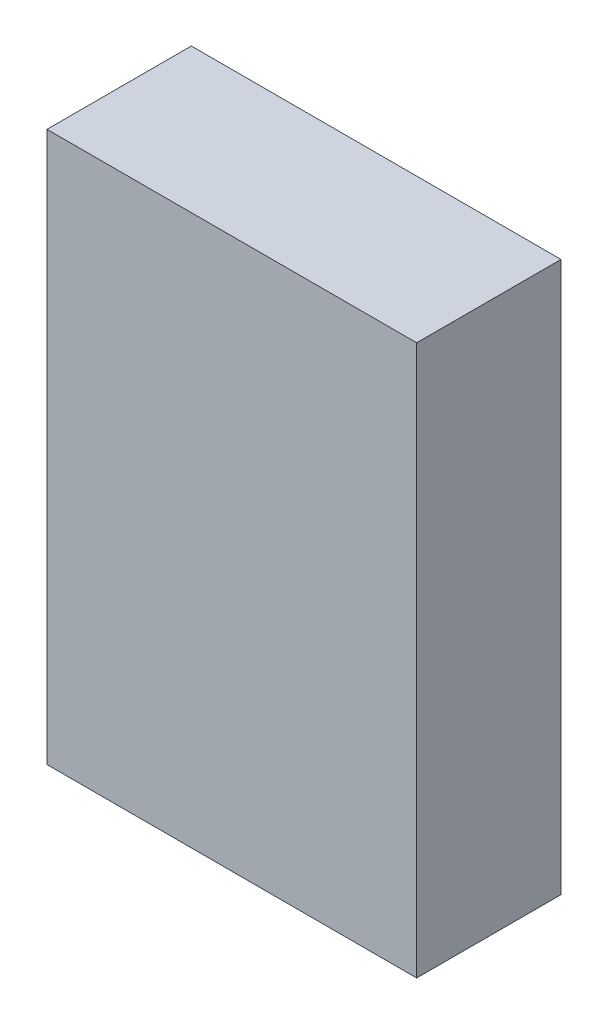
ISO-10303-21;
HEADER;
FILE_DESCRIPTION(('STEP AP214'),'2;1');
FILE_NAME('part.step','',(''),(''),'','','');
FILE_SCHEMA(('AUTOMOTIVE_DESIGN { 1 0 10303 214 1 1 1 1 }'));
ENDSEC;
DATA;
#1=APPLICATION_CONTEXT('core data for automotive mechanical design processes');
#2=APPLICATION_PROTOCOL_DEFINITION('international standard','automotive_design',2000,#1);
#3=PRODUCT_CONTEXT('',#1,'mechanical');
#4=PRODUCT('Part','Part','',(#3));
#5=PRODUCT_RELATED_PRODUCT_CATEGORY('part','',(#4));
#6=PRODUCT_DEFINITION_FORMATION('','',#4);
#7=PRODUCT_DEFINITION_CONTEXT('part definition',#1,'design');
#8=PRODUCT_DEFINITION('design','',#6,#7);
#9=PRODUCT_DEFINITION_SHAPE('','',#8);
#10=(LENGTH_UNIT() NAMED_UNIT(*) SI_UNIT(.MILLI.,.METRE.));
#11=(NAMED_UNIT(*) PLANE_ANGLE_UNIT() SI_UNIT($,.RADIAN.));
#12=(NAMED_UNIT(*) SI_UNIT($,.STERADIAN.) SOLID_ANGLE_UNIT());
#13=UNCERTAINTY_MEASURE_WITH_UNIT(LENGTH_MEASURE(1.E-05),#10,'distance_accuracy_value','');
#14=(GEOMETRIC_REPRESENTATION_CONTEXT(3) GLOBAL_UNCERTAINTY_ASSIGNED_CONTEXT((#13)) GLOBAL_UNIT_ASSIGNED_CONTEXT((#10,
#11,#12)) REPRESENTATION_CONTEXT('',''));
#15=CARTESIAN_POINT('',(0.,0.,0.));
#16=DIRECTION('',(0.,0.,1.));
#17=DIRECTION('',(1.,0.,0.));
#18=AXIS2_PLACEMENT_3D('',#15,#16,#17);
#19=CARTESIAN_POINT('',(1.02449122,1.52449276,0.80000094));
#20=DIRECTION('',(0.,0.,-1.));
#21=DIRECTION('',(-1.,0.,0.));
#22=AXIS2_PLACEMENT_3D('',#19,#20,#21);
#23=PLANE('',#22);
#24=DIRECTION('',(0.,1.,0.));
#25=VECTOR('',#24,1.);
#26=CARTESIAN_POINT('',(-1.02449122,1.52449276,0.80000094));
#27=LINE('',#26,#25);
#28=CARTESIAN_POINT('',(-1.02449122,1.52449276,0.80000094));
#29=VERTEX_POINT('',#28);
#30=CARTESIAN_POINT('',(-1.02449122,-1.52449276,0.80000094));
#31=VERTEX_POINT('',#30);
#32=EDGE_CURVE('E55',#29,#31,#27,.F.);
#33=ORIENTED_EDGE('',*,*,#32,.T.);
#34=DIRECTION('',(1.,0.,0.));
#35=VECTOR('',#34,1.);
#36=CARTESIAN_POINT('',(-1.02449122,-1.52449276,0.80000094));
#37=LINE('',#36,#35);
#38=CARTESIAN_POINT('',(1.02449122,-1.52449276,0.80000094));
#39=VERTEX_POINT('',#38);
#40=EDGE_CURVE('E57',#31,#39,#37,.T.);
#41=ORIENTED_EDGE('',*,*,#40,.T.);
#42=DIRECTION('',(0.,1.,0.));
#43=VECTOR('',#42,1.);
#44=CARTESIAN_POINT('',(1.02449122,-1.52449276,0.80000094));
#45=LINE('',#44,#43);
#46=CARTESIAN_POINT('',(1.02449122,1.52449276,0.80000094));
#47=VERTEX_POINT('',#46);
#48=EDGE_CURVE('E20',#39,#47,#45,.T.);
#49=ORIENTED_EDGE('',*,*,#48,.T.);
#50=DIRECTION('',(1.,0.,0.));
#51=VECTOR('',#50,1.);
#52=CARTESIAN_POINT('',(1.02449122,1.52449276,0.80000094));
#53=LINE('',#52,#51);
#54=EDGE_CURVE('E80',#47,#29,#53,.F.);
#55=ORIENTED_EDGE('',*,*,#54,.T.);
#56=EDGE_LOOP('',(#33,#41,#49,#55));
#57=FACE_BOUND('',#56,.T.);
#58=ADVANCED_FACE('F17',(#57),#23,.F.);
#59=CARTESIAN_POINT('',(1.02449122,-1.52449276,0.));
#60=DIRECTION('',(-1.,0.,0.));
#61=DIRECTION('',(0.,0.,1.));
#62=AXIS2_PLACEMENT_3D('',#59,#60,#61);
#63=PLANE('',#62);
#64=DIRECTION('',(0.,0.,-1.));
#65=VECTOR('',#64,1.);
#66=CARTESIAN_POINT('',(1.02449122,1.52449276,0.));
#67=LINE('',#66,#65);
#68=CARTESIAN_POINT('',(1.02449122,1.52449276,0.));
#69=VERTEX_POINT('',#68);
#70=EDGE_CURVE('E68',#69,#47,#67,.F.);
#71=ORIENTED_EDGE('',*,*,#70,.T.);
#72=ORIENTED_EDGE('',*,*,#48,.F.);
#73=DIRECTION('',(0.,0.,1.));
#74=VECTOR('',#73,1.);
#75=CARTESIAN_POINT('',(1.02449122,-1.52449276,0.));
#76=LINE('',#75,#74);
#77=CARTESIAN_POINT('',(1.02449122,-1.52449276,0.));
#78=VERTEX_POINT('',#77);
#79=EDGE_CURVE('E63',#39,#78,#76,.F.);
#80=ORIENTED_EDGE('',*,*,#79,.T.);
#81=DIRECTION('',(0.,1.,0.));
#82=VECTOR('',#81,1.);
#83=CARTESIAN_POINT('',(1.02449122,1.52449276,0.));
#84=LINE('',#83,#82);
#85=EDGE_CURVE('E83',#69,#78,#84,.F.);
#86=ORIENTED_EDGE('',*,*,#85,.F.);
#87=EDGE_LOOP('',(#71,#72,#80,#86));
#88=FACE_BOUND('',#87,.T.);
#89=ADVANCED_FACE('F65',(#88),#63,.F.);
#90=CARTESIAN_POINT('',(-1.02449122,-1.52449276,0.));
#91=DIRECTION('',(0.,1.,0.));
#92=DIRECTION('',(0.,0.,1.));
#93=AXIS2_PLACEMENT_3D('',#90,#91,#92);
#94=PLANE('',#93);
#95=ORIENTED_EDGE('',*,*,#79,.F.);
#96=ORIENTED_EDGE('',*,*,#40,.F.);
#97=DIRECTION('',(0.,0.,-1.));
#98=VECTOR('',#97,1.);
#99=CARTESIAN_POINT('',(-1.02449122,-1.52449276,0.));
#100=LINE('',#99,#98);
#101=CARTESIAN_POINT('',(-1.02449122,-1.52449276,0.));
#102=VERTEX_POINT('',#101);
#103=EDGE_CURVE('E75',#31,#102,#100,.T.);
#104=ORIENTED_EDGE('',*,*,#103,.T.);
#105=DIRECTION('',(-1.,0.,0.));
#106=VECTOR('',#105,1.);
#107=CARTESIAN_POINT('',(1.02449122,-1.52449276,0.));
#108=LINE('',#107,#106);
#109=EDGE_CURVE('E72',#78,#102,#108,.T.);
#110=ORIENTED_EDGE('',*,*,#109,.F.);
#111=EDGE_LOOP('',(#95,#96,#104,#110));
#112=FACE_BOUND('',#111,.T.);
#113=ADVANCED_FACE('F70',(#112),#94,.F.);
#114=CARTESIAN_POINT('',(-1.02449122,1.52449276,0.));
#115=DIRECTION('',(1.,0.,0.));
#116=DIRECTION('',(0.,0.,-1.));
#117=AXIS2_PLACEMENT_3D('',#114,#115,#116);
#118=PLANE('',#117);
#119=ORIENTED_EDGE('',*,*,#103,.F.);
#120=ORIENTED_EDGE('',*,*,#32,.F.);
#121=DIRECTION('',(0.,0.,-1.));
#122=VECTOR('',#121,1.);
#123=CARTESIAN_POINT('',(-1.02449122,1.52449276,0.));
#124=LINE('',#123,#122);
#125=CARTESIAN_POINT('',(-1.02449122,1.52449276,0.));
#126=VERTEX_POINT('',#125);
#127=EDGE_CURVE('E35',#29,#126,#124,.T.);
#128=ORIENTED_EDGE('',*,*,#127,.T.);
#129=DIRECTION('',(0.,1.,0.));
#130=VECTOR('',#129,1.);
#131=CARTESIAN_POINT('',(-1.02449122,1.52449276,0.));
#132=LINE('',#131,#130);
#133=EDGE_CURVE('E26',#102,#126,#132,.T.);
#134=ORIENTED_EDGE('',*,*,#133,.F.);
#135=EDGE_LOOP('',(#119,#120,#128,#134));
#136=FACE_BOUND('',#135,.T.);
#137=ADVANCED_FACE('F89',(#136),#118,.F.);
#138=CARTESIAN_POINT('',(1.02449122,1.52449276,0.));
#139=DIRECTION('',(0.,-1.,0.));
#140=DIRECTION('',(0.,0.,-1.));
#141=AXIS2_PLACEMENT_3D('',#138,#139,#140);
#142=PLANE('',#141);
#143=ORIENTED_EDGE('',*,*,#127,.F.);
#144=ORIENTED_EDGE('',*,*,#54,.F.);
#145=ORIENTED_EDGE('',*,*,#70,.F.);
#146=DIRECTION('',(-1.,0.,0.));
#147=VECTOR('',#146,1.);
#148=CARTESIAN_POINT('',(1.02449122,1.52449276,0.));
#149=LINE('',#148,#147);
#150=EDGE_CURVE('E11',#126,#69,#149,.F.);
#151=ORIENTED_EDGE('',*,*,#150,.F.);
#152=EDGE_LOOP('',(#143,#144,#145,#151));
#153=FACE_BOUND('',#152,.T.);
#154=ADVANCED_FACE('F91',(#153),#142,.F.);
#155=CARTESIAN_POINT('',(1.02449122,1.52449276,0.));
#156=DIRECTION('',(0.,0.,-1.));
#157=DIRECTION('',(-1.,0.,0.));
#158=AXIS2_PLACEMENT_3D('',#155,#156,#157);
#159=PLANE('',#158);
#160=ORIENTED_EDGE('',*,*,#133,.T.);
#161=ORIENTED_EDGE('',*,*,#150,.T.);
#162=ORIENTED_EDGE('',*,*,#85,.T.);
#163=ORIENTED_EDGE('',*,*,#109,.T.);
#164=EDGE_LOOP('',(#160,#161,#162,#163));
#165=FACE_BOUND('',#164,.T.);
#166=ADVANCED_FACE('F88',(#165),#159,.T.);
#167=CLOSED_SHELL('',(#58,#89,#113,#137,#154,#166));
#168=MANIFOLD_SOLID_BREP('B1',#167);
#169=ADVANCED_BREP_SHAPE_REPRESENTATION('',(#18,#168),#14);
#170=SHAPE_DEFINITION_REPRESENTATION(#9,#169);
ENDSEC;
END-ISO-10303-21;
